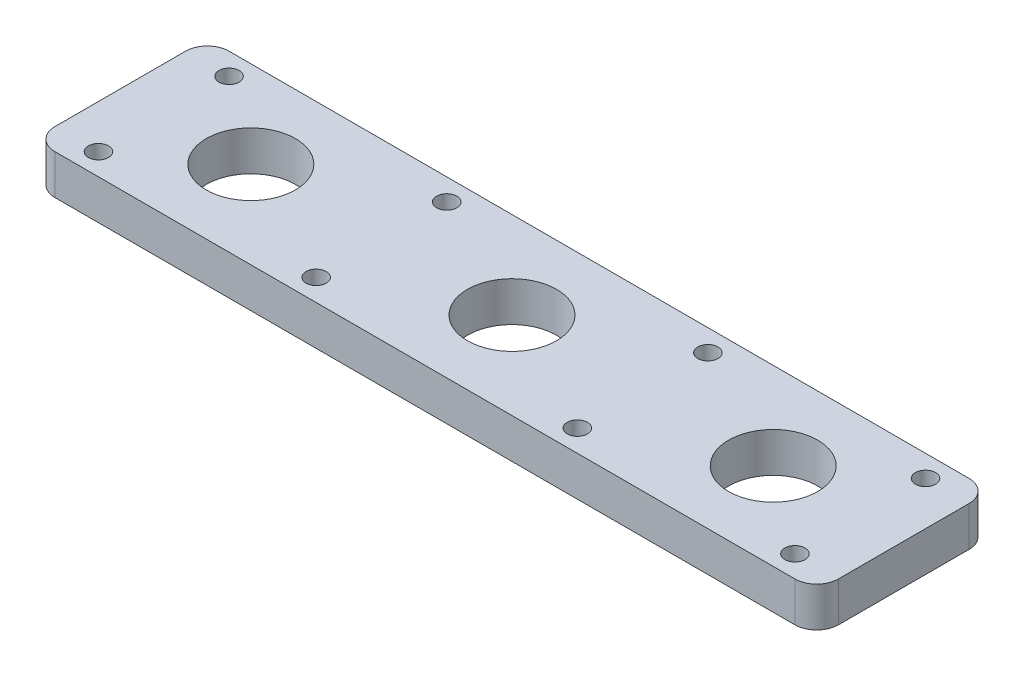
ISO-10303-21;
HEADER;
FILE_DESCRIPTION(('STEP AP214'),'2;1');
FILE_NAME('part.step','',(''),(''),'','','');
FILE_SCHEMA(('AUTOMOTIVE_DESIGN { 1 0 10303 214 1 1 1 1 }'));
ENDSEC;
DATA;
#1=APPLICATION_CONTEXT('core data for automotive mechanical design processes');
#2=APPLICATION_PROTOCOL_DEFINITION('international standard','automotive_design',2000,#1);
#3=PRODUCT_CONTEXT('',#1,'mechanical');
#4=PRODUCT('Part','Part','',(#3));
#5=PRODUCT_RELATED_PRODUCT_CATEGORY('part','',(#4));
#6=PRODUCT_DEFINITION_FORMATION('','',#4);
#7=PRODUCT_DEFINITION_CONTEXT('part definition',#1,'design');
#8=PRODUCT_DEFINITION('design','',#6,#7);
#9=PRODUCT_DEFINITION_SHAPE('','',#8);
#10=(LENGTH_UNIT() NAMED_UNIT(*) SI_UNIT(.MILLI.,.METRE.));
#11=(NAMED_UNIT(*) PLANE_ANGLE_UNIT() SI_UNIT($,.RADIAN.));
#12=(NAMED_UNIT(*) SI_UNIT($,.STERADIAN.) SOLID_ANGLE_UNIT());
#13=UNCERTAINTY_MEASURE_WITH_UNIT(LENGTH_MEASURE(1.E-05),#10,'distance_accuracy_value','');
#14=(GEOMETRIC_REPRESENTATION_CONTEXT(3) GLOBAL_UNCERTAINTY_ASSIGNED_CONTEXT((#13)) GLOBAL_UNIT_ASSIGNED_CONTEXT((#10,
#11,#12)) REPRESENTATION_CONTEXT('',''));
#15=CARTESIAN_POINT('',(0.,0.,0.));
#16=DIRECTION('',(0.,0.,1.));
#17=DIRECTION('',(1.,0.,0.));
#18=AXIS2_PLACEMENT_3D('',#15,#16,#17);
#19=CARTESIAN_POINT('',(0.,5.8,-25.4));
#20=DIRECTION('',(0.,1.,0.));
#21=DIRECTION('',(0.,0.,1.));
#22=AXIS2_PLACEMENT_3D('',#19,#20,#21);
#23=PLANE('',#22);
#24=CARTESIAN_POINT('',(-107.95,5.8,-22.225));
#25=DIRECTION('',(0.,1.,0.));
#26=DIRECTION('',(0.,0.,1.));
#27=AXIS2_PLACEMENT_3D('',#24,#25,#26);
#28=CIRCLE('',#27,1.47319999999999);
#29=CARTESIAN_POINT('',(-107.95,5.8,-20.7518));
#30=VERTEX_POINT('',#29);
#31=EDGE_CURVE('E236',#30,#30,#28,.T.);
#32=ORIENTED_EDGE('',*,*,#31,.F.);
#33=EDGE_LOOP('',(#32));
#34=FACE_BOUND('',#33,.T.);
#35=CARTESIAN_POINT('',(-107.95,5.8,-3.17499999999999));
#36=DIRECTION('',(0.,1.,0.));
#37=DIRECTION('',(0.,0.,1.));
#38=AXIS2_PLACEMENT_3D('',#35,#36,#37);
#39=CIRCLE('',#38,1.47319999999999);
#40=CARTESIAN_POINT('',(-107.95,5.8,-1.7018));
#41=VERTEX_POINT('',#40);
#42=EDGE_CURVE('E230',#41,#41,#39,.T.);
#43=ORIENTED_EDGE('',*,*,#42,.F.);
#44=EDGE_LOOP('',(#43));
#45=FACE_BOUND('',#44,.T.);
#46=CARTESIAN_POINT('',(-76.2,5.8,-22.225));
#47=DIRECTION('',(0.,1.,0.));
#48=DIRECTION('',(0.,0.,1.));
#49=AXIS2_PLACEMENT_3D('',#46,#47,#48);
#50=CIRCLE('',#49,1.47319999999999);
#51=CARTESIAN_POINT('',(-76.2,5.8,-20.7518));
#52=VERTEX_POINT('',#51);
#53=EDGE_CURVE('E224',#52,#52,#50,.T.);
#54=ORIENTED_EDGE('',*,*,#53,.F.);
#55=EDGE_LOOP('',(#54));
#56=FACE_BOUND('',#55,.T.);
#57=CARTESIAN_POINT('',(-76.2,5.8,-3.17499999999999));
#58=DIRECTION('',(0.,1.,0.));
#59=DIRECTION('',(0.,0.,1.));
#60=AXIS2_PLACEMENT_3D('',#57,#58,#59);
#61=CIRCLE('',#60,1.47319999999999);
#62=CARTESIAN_POINT('',(-76.2,5.8,-1.7018));
#63=VERTEX_POINT('',#62);
#64=EDGE_CURVE('E218',#63,#63,#61,.T.);
#65=ORIENTED_EDGE('',*,*,#64,.F.);
#66=EDGE_LOOP('',(#65));
#67=FACE_BOUND('',#66,.T.);
#68=CARTESIAN_POINT('',(-6.34999999999999,5.8,-22.225));
#69=DIRECTION('',(0.,1.,0.));
#70=DIRECTION('',(0.,0.,1.));
#71=AXIS2_PLACEMENT_3D('',#68,#69,#70);
#72=CIRCLE('',#71,1.4732);
#73=CARTESIAN_POINT('',(-6.34999999999999,5.8,-20.7518));
#74=VERTEX_POINT('',#73);
#75=EDGE_CURVE('E212',#74,#74,#72,.T.);
#76=ORIENTED_EDGE('',*,*,#75,.F.);
#77=EDGE_LOOP('',(#76));
#78=FACE_BOUND('',#77,.T.);
#79=CARTESIAN_POINT('',(-38.1,5.8,-22.225));
#80=DIRECTION('',(0.,1.,0.));
#81=DIRECTION('',(0.,0.,1.));
#82=AXIS2_PLACEMENT_3D('',#79,#80,#81);
#83=CIRCLE('',#82,1.4732);
#84=CARTESIAN_POINT('',(-38.1,5.8,-20.7518));
#85=VERTEX_POINT('',#84);
#86=EDGE_CURVE('E206',#85,#85,#83,.T.);
#87=ORIENTED_EDGE('',*,*,#86,.F.);
#88=EDGE_LOOP('',(#87));
#89=FACE_BOUND('',#88,.T.);
#90=CARTESIAN_POINT('',(-38.1,5.8,-3.17499999999999));
#91=DIRECTION('',(0.,1.,0.));
#92=DIRECTION('',(0.,0.,1.));
#93=AXIS2_PLACEMENT_3D('',#90,#91,#92);
#94=CIRCLE('',#93,1.4732);
#95=CARTESIAN_POINT('',(-38.1,5.8,-1.70179999999999));
#96=VERTEX_POINT('',#95);
#97=EDGE_CURVE('E200',#96,#96,#94,.T.);
#98=ORIENTED_EDGE('',*,*,#97,.F.);
#99=EDGE_LOOP('',(#98));
#100=FACE_BOUND('',#99,.T.);
#101=CARTESIAN_POINT('',(-6.34999999999999,5.8,-3.175));
#102=DIRECTION('',(0.,1.,0.));
#103=DIRECTION('',(0.,0.,1.));
#104=AXIS2_PLACEMENT_3D('',#101,#102,#103);
#105=CIRCLE('',#104,1.4732);
#106=CARTESIAN_POINT('',(-6.34999999999999,5.8,-1.7018));
#107=VERTEX_POINT('',#106);
#108=EDGE_CURVE('E194',#107,#107,#105,.T.);
#109=ORIENTED_EDGE('',*,*,#108,.F.);
#110=EDGE_LOOP('',(#109));
#111=FACE_BOUND('',#110,.T.);
#112=CARTESIAN_POINT('',(-57.15,5.8,-12.7));
#113=DIRECTION('',(0.,1.,0.));
#114=DIRECTION('',(0.,0.,1.));
#115=AXIS2_PLACEMENT_3D('',#112,#113,#114);
#116=CIRCLE('',#115,6.5);
#117=CARTESIAN_POINT('',(-57.15,5.8,-6.19999999999999));
#118=VERTEX_POINT('',#117);
#119=EDGE_CURVE('E178',#118,#118,#116,.T.);
#120=ORIENTED_EDGE('',*,*,#119,.F.);
#121=EDGE_LOOP('',(#120));
#122=FACE_BOUND('',#121,.T.);
#123=DIRECTION('',(1.,0.,0.));
#124=VECTOR('',#123,1.);
#125=CARTESIAN_POINT('',(0.,5.8,0.));
#126=LINE('',#125,#124);
#127=CARTESIAN_POINT('',(-111.125,5.8,0.));
#128=VERTEX_POINT('',#127);
#129=CARTESIAN_POINT('',(-3.175,5.8,0.));
#130=VERTEX_POINT('',#129);
#131=EDGE_CURVE('E134',#128,#130,#126,.T.);
#132=ORIENTED_EDGE('',*,*,#131,.T.);
#133=CARTESIAN_POINT('',(-3.175,5.8,-3.175));
#134=DIRECTION('',(0.,1.,0.));
#135=DIRECTION('',(0.,0.,1.));
#136=AXIS2_PLACEMENT_3D('',#133,#134,#135);
#137=CIRCLE('',#136,3.175);
#138=CARTESIAN_POINT('',(0.,5.8,-3.175));
#139=VERTEX_POINT('',#138);
#140=EDGE_CURVE('E153',#130,#139,#137,.T.);
#141=ORIENTED_EDGE('',*,*,#140,.T.);
#142=DIRECTION('',(0.,0.,-1.));
#143=VECTOR('',#142,1.);
#144=CARTESIAN_POINT('',(0.,5.8,0.));
#145=LINE('',#144,#143);
#146=CARTESIAN_POINT('',(0.,5.8,-22.225));
#147=VERTEX_POINT('',#146);
#148=EDGE_CURVE('E117',#139,#147,#145,.T.);
#149=ORIENTED_EDGE('',*,*,#148,.T.);
#150=CARTESIAN_POINT('',(-3.17500000000001,5.8,-22.225));
#151=DIRECTION('',(0.,1.,0.));
#152=DIRECTION('',(0.,0.,1.));
#153=AXIS2_PLACEMENT_3D('',#150,#151,#152);
#154=CIRCLE('',#153,3.175);
#155=CARTESIAN_POINT('',(-3.17500000000001,5.8,-25.4));
#156=VERTEX_POINT('',#155);
#157=EDGE_CURVE('E151',#147,#156,#154,.T.);
#158=ORIENTED_EDGE('',*,*,#157,.T.);
#159=DIRECTION('',(-1.,0.,0.));
#160=VECTOR('',#159,1.);
#161=CARTESIAN_POINT('',(0.,5.8,-25.4));
#162=LINE('',#161,#160);
#163=CARTESIAN_POINT('',(-111.125,5.8,-25.4));
#164=VERTEX_POINT('',#163);
#165=EDGE_CURVE('E173',#156,#164,#162,.T.);
#166=ORIENTED_EDGE('',*,*,#165,.T.);
#167=CARTESIAN_POINT('',(-111.125,5.8,-22.225));
#168=DIRECTION('',(0.,1.,0.));
#169=DIRECTION('',(0.,0.,1.));
#170=AXIS2_PLACEMENT_3D('',#167,#168,#169);
#171=CIRCLE('',#170,3.175);
#172=CARTESIAN_POINT('',(-114.3,5.8,-22.225));
#173=VERTEX_POINT('',#172);
#174=EDGE_CURVE('E52',#164,#173,#171,.T.);
#175=ORIENTED_EDGE('',*,*,#174,.T.);
#176=DIRECTION('',(0.,0.,1.));
#177=VECTOR('',#176,1.);
#178=CARTESIAN_POINT('',(-114.3,5.8,0.));
#179=LINE('',#178,#177);
#180=CARTESIAN_POINT('',(-114.3,5.8,-3.17499999999999));
#181=VERTEX_POINT('',#180);
#182=EDGE_CURVE('E163',#173,#181,#179,.T.);
#183=ORIENTED_EDGE('',*,*,#182,.T.);
#184=CARTESIAN_POINT('',(-111.125,5.8,-3.17499999999999));
#185=DIRECTION('',(0.,1.,0.));
#186=DIRECTION('',(0.,0.,1.));
#187=AXIS2_PLACEMENT_3D('',#184,#185,#186);
#188=CIRCLE('',#187,3.175);
#189=EDGE_CURVE('E149',#181,#128,#188,.T.);
#190=ORIENTED_EDGE('',*,*,#189,.T.);
#191=EDGE_LOOP('',(#132,#141,#149,#158,#166,#175,#183,#190));
#192=FACE_BOUND('',#191,.T.);
#193=CARTESIAN_POINT('',(-95.25,5.8,-12.7));
#194=DIRECTION('',(0.,1.,0.));
#195=DIRECTION('',(0.,0.,1.));
#196=AXIS2_PLACEMENT_3D('',#193,#194,#195);
#197=CIRCLE('',#196,6.5);
#198=CARTESIAN_POINT('',(-95.25,5.8,-6.19999999999999));
#199=VERTEX_POINT('',#198);
#200=EDGE_CURVE('E125',#199,#199,#197,.T.);
#201=ORIENTED_EDGE('',*,*,#200,.F.);
#202=EDGE_LOOP('',(#201));
#203=FACE_BOUND('',#202,.T.);
#204=CARTESIAN_POINT('',(-19.05,5.8,-12.7));
#205=DIRECTION('',(0.,1.,0.));
#206=DIRECTION('',(0.,0.,1.));
#207=AXIS2_PLACEMENT_3D('',#204,#205,#206);
#208=CIRCLE('',#207,6.5);
#209=CARTESIAN_POINT('',(-19.05,5.8,-6.19999999999999));
#210=VERTEX_POINT('',#209);
#211=EDGE_CURVE('E183',#210,#210,#208,.T.);
#212=ORIENTED_EDGE('',*,*,#211,.F.);
#213=EDGE_LOOP('',(#212));
#214=FACE_BOUND('',#213,.T.);
#215=ADVANCED_FACE('F32',(#34,#45,#56,#67,#78,#89,#100,#111,#122,#192,#203,#214),#23,.T.);
#216=CARTESIAN_POINT('',(0.,0.,-25.4));
#217=DIRECTION('',(0.,1.,0.));
#218=DIRECTION('',(0.,0.,1.));
#219=AXIS2_PLACEMENT_3D('',#216,#217,#218);
#220=PLANE('',#219);
#221=CARTESIAN_POINT('',(-107.95,0.,-22.225));
#222=DIRECTION('',(0.,1.,0.));
#223=DIRECTION('',(0.,0.,1.));
#224=AXIS2_PLACEMENT_3D('',#221,#222,#223);
#225=CIRCLE('',#224,1.47319999999999);
#226=CARTESIAN_POINT('',(-107.95,0.,-20.7518));
#227=VERTEX_POINT('',#226);
#228=EDGE_CURVE('E233',#227,#227,#225,.T.);
#229=ORIENTED_EDGE('',*,*,#228,.T.);
#230=EDGE_LOOP('',(#229));
#231=FACE_BOUND('',#230,.T.);
#232=CARTESIAN_POINT('',(-107.95,0.,-3.17499999999999));
#233=DIRECTION('',(0.,1.,0.));
#234=DIRECTION('',(0.,0.,1.));
#235=AXIS2_PLACEMENT_3D('',#232,#233,#234);
#236=CIRCLE('',#235,1.47319999999999);
#237=CARTESIAN_POINT('',(-107.95,0.,-1.7018));
#238=VERTEX_POINT('',#237);
#239=EDGE_CURVE('E227',#238,#238,#236,.T.);
#240=ORIENTED_EDGE('',*,*,#239,.T.);
#241=EDGE_LOOP('',(#240));
#242=FACE_BOUND('',#241,.T.);
#243=CARTESIAN_POINT('',(-76.2,0.,-22.225));
#244=DIRECTION('',(0.,1.,0.));
#245=DIRECTION('',(0.,0.,1.));
#246=AXIS2_PLACEMENT_3D('',#243,#244,#245);
#247=CIRCLE('',#246,1.47319999999999);
#248=CARTESIAN_POINT('',(-76.2,0.,-20.7518));
#249=VERTEX_POINT('',#248);
#250=EDGE_CURVE('E221',#249,#249,#247,.T.);
#251=ORIENTED_EDGE('',*,*,#250,.T.);
#252=EDGE_LOOP('',(#251));
#253=FACE_BOUND('',#252,.T.);
#254=CARTESIAN_POINT('',(-76.2,0.,-3.17499999999999));
#255=DIRECTION('',(0.,1.,0.));
#256=DIRECTION('',(0.,0.,1.));
#257=AXIS2_PLACEMENT_3D('',#254,#255,#256);
#258=CIRCLE('',#257,1.47319999999999);
#259=CARTESIAN_POINT('',(-76.2,0.,-1.7018));
#260=VERTEX_POINT('',#259);
#261=EDGE_CURVE('E215',#260,#260,#258,.T.);
#262=ORIENTED_EDGE('',*,*,#261,.T.);
#263=EDGE_LOOP('',(#262));
#264=FACE_BOUND('',#263,.T.);
#265=CARTESIAN_POINT('',(-6.34999999999999,0.,-22.225));
#266=DIRECTION('',(0.,1.,0.));
#267=DIRECTION('',(0.,0.,1.));
#268=AXIS2_PLACEMENT_3D('',#265,#266,#267);
#269=CIRCLE('',#268,1.4732);
#270=CARTESIAN_POINT('',(-6.34999999999999,0.,-20.7518));
#271=VERTEX_POINT('',#270);
#272=EDGE_CURVE('E209',#271,#271,#269,.T.);
#273=ORIENTED_EDGE('',*,*,#272,.T.);
#274=EDGE_LOOP('',(#273));
#275=FACE_BOUND('',#274,.T.);
#276=CARTESIAN_POINT('',(-38.1,0.,-22.225));
#277=DIRECTION('',(0.,1.,0.));
#278=DIRECTION('',(0.,0.,1.));
#279=AXIS2_PLACEMENT_3D('',#276,#277,#278);
#280=CIRCLE('',#279,1.4732);
#281=CARTESIAN_POINT('',(-38.1,0.,-20.7518));
#282=VERTEX_POINT('',#281);
#283=EDGE_CURVE('E203',#282,#282,#280,.T.);
#284=ORIENTED_EDGE('',*,*,#283,.T.);
#285=EDGE_LOOP('',(#284));
#286=FACE_BOUND('',#285,.T.);
#287=CARTESIAN_POINT('',(-38.1,0.,-3.17499999999999));
#288=DIRECTION('',(0.,1.,0.));
#289=DIRECTION('',(0.,0.,1.));
#290=AXIS2_PLACEMENT_3D('',#287,#288,#289);
#291=CIRCLE('',#290,1.4732);
#292=CARTESIAN_POINT('',(-38.1,0.,-1.70179999999999));
#293=VERTEX_POINT('',#292);
#294=EDGE_CURVE('E197',#293,#293,#291,.T.);
#295=ORIENTED_EDGE('',*,*,#294,.T.);
#296=EDGE_LOOP('',(#295));
#297=FACE_BOUND('',#296,.T.);
#298=CARTESIAN_POINT('',(-6.34999999999999,0.,-3.175));
#299=DIRECTION('',(0.,1.,0.));
#300=DIRECTION('',(0.,0.,1.));
#301=AXIS2_PLACEMENT_3D('',#298,#299,#300);
#302=CIRCLE('',#301,1.4732);
#303=CARTESIAN_POINT('',(-6.34999999999999,0.,-1.7018));
#304=VERTEX_POINT('',#303);
#305=EDGE_CURVE('E189',#304,#304,#302,.T.);
#306=ORIENTED_EDGE('',*,*,#305,.T.);
#307=EDGE_LOOP('',(#306));
#308=FACE_BOUND('',#307,.T.);
#309=CARTESIAN_POINT('',(-57.15,0.,-12.7));
#310=DIRECTION('',(0.,1.,0.));
#311=DIRECTION('',(0.,0.,1.));
#312=AXIS2_PLACEMENT_3D('',#309,#310,#311);
#313=CIRCLE('',#312,6.5);
#314=CARTESIAN_POINT('',(-57.15,0.,-6.19999999999999));
#315=VERTEX_POINT('',#314);
#316=EDGE_CURVE('E180',#315,#315,#313,.T.);
#317=ORIENTED_EDGE('',*,*,#316,.T.);
#318=EDGE_LOOP('',(#317));
#319=FACE_BOUND('',#318,.T.);
#320=DIRECTION('',(0.,0.,-1.));
#321=VECTOR('',#320,1.);
#322=CARTESIAN_POINT('',(0.,0.,0.));
#323=LINE('',#322,#321);
#324=CARTESIAN_POINT('',(0.,0.,-3.175));
#325=VERTEX_POINT('',#324);
#326=CARTESIAN_POINT('',(0.,0.,-22.225));
#327=VERTEX_POINT('',#326);
#328=EDGE_CURVE('E114',#325,#327,#323,.T.);
#329=ORIENTED_EDGE('',*,*,#328,.F.);
#330=CARTESIAN_POINT('',(-3.175,0.,-3.175));
#331=DIRECTION('',(0.,1.,0.));
#332=DIRECTION('',(0.,0.,1.));
#333=AXIS2_PLACEMENT_3D('',#330,#331,#332);
#334=CIRCLE('',#333,3.175);
#335=CARTESIAN_POINT('',(-3.175,0.,0.));
#336=VERTEX_POINT('',#335);
#337=EDGE_CURVE('E97',#325,#336,#334,.F.);
#338=ORIENTED_EDGE('',*,*,#337,.T.);
#339=DIRECTION('',(1.,0.,0.));
#340=VECTOR('',#339,1.);
#341=CARTESIAN_POINT('',(0.,0.,0.));
#342=LINE('',#341,#340);
#343=CARTESIAN_POINT('',(-111.125,0.,0.));
#344=VERTEX_POINT('',#343);
#345=EDGE_CURVE('E138',#344,#336,#342,.T.);
#346=ORIENTED_EDGE('',*,*,#345,.F.);
#347=CARTESIAN_POINT('',(-111.125,0.,-3.17499999999999));
#348=DIRECTION('',(0.,1.,0.));
#349=DIRECTION('',(0.,0.,1.));
#350=AXIS2_PLACEMENT_3D('',#347,#348,#349);
#351=CIRCLE('',#350,3.175);
#352=CARTESIAN_POINT('',(-114.3,0.,-3.17499999999999));
#353=VERTEX_POINT('',#352);
#354=EDGE_CURVE('E142',#344,#353,#351,.F.);
#355=ORIENTED_EDGE('',*,*,#354,.T.);
#356=DIRECTION('',(0.,0.,1.));
#357=VECTOR('',#356,1.);
#358=CARTESIAN_POINT('',(-114.3,0.,0.));
#359=LINE('',#358,#357);
#360=CARTESIAN_POINT('',(-114.3,0.,-22.225));
#361=VERTEX_POINT('',#360);
#362=EDGE_CURVE('E128',#361,#353,#359,.T.);
#363=ORIENTED_EDGE('',*,*,#362,.F.);
#364=CARTESIAN_POINT('',(-111.125,0.,-22.225));
#365=DIRECTION('',(0.,1.,0.));
#366=DIRECTION('',(0.,0.,1.));
#367=AXIS2_PLACEMENT_3D('',#364,#365,#366);
#368=CIRCLE('',#367,3.175);
#369=CARTESIAN_POINT('',(-111.125,0.,-25.4));
#370=VERTEX_POINT('',#369);
#371=EDGE_CURVE('E118',#361,#370,#368,.F.);
#372=ORIENTED_EDGE('',*,*,#371,.T.);
#373=DIRECTION('',(-1.,0.,0.));
#374=VECTOR('',#373,1.);
#375=CARTESIAN_POINT('',(0.,0.,-25.4));
#376=LINE('',#375,#374);
#377=CARTESIAN_POINT('',(-3.17500000000001,0.,-25.4));
#378=VERTEX_POINT('',#377);
#379=EDGE_CURVE('E124',#378,#370,#376,.T.);
#380=ORIENTED_EDGE('',*,*,#379,.F.);
#381=CARTESIAN_POINT('',(-3.17500000000001,0.,-22.225));
#382=DIRECTION('',(0.,1.,0.));
#383=DIRECTION('',(0.,0.,1.));
#384=AXIS2_PLACEMENT_3D('',#381,#382,#383);
#385=CIRCLE('',#384,3.175);
#386=EDGE_CURVE('E108',#378,#327,#385,.F.);
#387=ORIENTED_EDGE('',*,*,#386,.T.);
#388=EDGE_LOOP('',(#329,#338,#346,#355,#363,#372,#380,#387));
#389=FACE_BOUND('',#388,.T.);
#390=CARTESIAN_POINT('',(-95.25,0.,-12.7));
#391=DIRECTION('',(0.,1.,0.));
#392=DIRECTION('',(0.,0.,1.));
#393=AXIS2_PLACEMENT_3D('',#390,#391,#392);
#394=CIRCLE('',#393,6.5);
#395=CARTESIAN_POINT('',(-95.25,0.,-6.19999999999999));
#396=VERTEX_POINT('',#395);
#397=EDGE_CURVE('E131',#396,#396,#394,.T.);
#398=ORIENTED_EDGE('',*,*,#397,.T.);
#399=EDGE_LOOP('',(#398));
#400=FACE_BOUND('',#399,.T.);
#401=CARTESIAN_POINT('',(-19.05,0.,-12.7));
#402=DIRECTION('',(0.,1.,0.));
#403=DIRECTION('',(0.,0.,1.));
#404=AXIS2_PLACEMENT_3D('',#401,#402,#403);
#405=CIRCLE('',#404,6.5);
#406=CARTESIAN_POINT('',(-19.05,0.,-6.19999999999999));
#407=VERTEX_POINT('',#406);
#408=EDGE_CURVE('E186',#407,#407,#405,.T.);
#409=ORIENTED_EDGE('',*,*,#408,.T.);
#410=EDGE_LOOP('',(#409));
#411=FACE_BOUND('',#410,.T.);
#412=ADVANCED_FACE('F121',(#231,#242,#253,#264,#275,#286,#297,#308,#319,#389,#400,#411),#220,.F.);
#413=CARTESIAN_POINT('',(0.,5.8,0.));
#414=DIRECTION('',(-1.,0.,0.));
#415=DIRECTION('',(0.,0.,1.));
#416=AXIS2_PLACEMENT_3D('',#413,#414,#415);
#417=PLANE('',#416);
#418=ORIENTED_EDGE('',*,*,#148,.F.);
#419=DIRECTION('',(0.,-1.,0.));
#420=VECTOR('',#419,1.);
#421=CARTESIAN_POINT('',(0.,5.8,-3.175));
#422=LINE('',#421,#420);
#423=EDGE_CURVE('E101',#139,#325,#422,.T.);
#424=ORIENTED_EDGE('',*,*,#423,.T.);
#425=ORIENTED_EDGE('',*,*,#328,.T.);
#426=DIRECTION('',(0.,-1.,0.));
#427=VECTOR('',#426,1.);
#428=CARTESIAN_POINT('',(0.,5.8,-22.225));
#429=LINE('',#428,#427);
#430=EDGE_CURVE('E119',#327,#147,#429,.F.);
#431=ORIENTED_EDGE('',*,*,#430,.T.);
#432=EDGE_LOOP('',(#418,#424,#425,#431));
#433=FACE_BOUND('',#432,.T.);
#434=ADVANCED_FACE('F113',(#433),#417,.F.);
#435=CARTESIAN_POINT('',(0.,5.8,-25.4));
#436=DIRECTION('',(0.,0.,1.));
#437=DIRECTION('',(1.,0.,0.));
#438=AXIS2_PLACEMENT_3D('',#435,#436,#437);
#439=PLANE('',#438);
#440=ORIENTED_EDGE('',*,*,#165,.F.);
#441=DIRECTION('',(0.,-1.,0.));
#442=VECTOR('',#441,1.);
#443=CARTESIAN_POINT('',(-3.17500000000001,5.8,-25.4));
#444=LINE('',#443,#442);
#445=EDGE_CURVE('E157',#156,#378,#444,.T.);
#446=ORIENTED_EDGE('',*,*,#445,.T.);
#447=ORIENTED_EDGE('',*,*,#379,.T.);
#448=DIRECTION('',(0.,-1.,0.));
#449=VECTOR('',#448,1.);
#450=CARTESIAN_POINT('',(-111.125,5.8,-25.4));
#451=LINE('',#450,#449);
#452=EDGE_CURVE('E155',#370,#164,#451,.F.);
#453=ORIENTED_EDGE('',*,*,#452,.T.);
#454=EDGE_LOOP('',(#440,#446,#447,#453));
#455=FACE_BOUND('',#454,.T.);
#456=ADVANCED_FACE('F279',(#455),#439,.F.);
#457=CARTESIAN_POINT('',(-114.3,5.8,0.));
#458=DIRECTION('',(1.,0.,0.));
#459=DIRECTION('',(0.,0.,-1.));
#460=AXIS2_PLACEMENT_3D('',#457,#458,#459);
#461=PLANE('',#460);
#462=ORIENTED_EDGE('',*,*,#362,.T.);
#463=DIRECTION('',(0.,-1.,0.));
#464=VECTOR('',#463,1.);
#465=CARTESIAN_POINT('',(-114.3,5.8,-3.17499999999999));
#466=LINE('',#465,#464);
#467=EDGE_CURVE('E11',#353,#181,#466,.F.);
#468=ORIENTED_EDGE('',*,*,#467,.T.);
#469=ORIENTED_EDGE('',*,*,#182,.F.);
#470=DIRECTION('',(0.,-1.,0.));
#471=VECTOR('',#470,1.);
#472=CARTESIAN_POINT('',(-114.3,5.8,-22.225));
#473=LINE('',#472,#471);
#474=EDGE_CURVE('E40',#173,#361,#473,.T.);
#475=ORIENTED_EDGE('',*,*,#474,.T.);
#476=EDGE_LOOP('',(#462,#468,#469,#475));
#477=FACE_BOUND('',#476,.T.);
#478=ADVANCED_FACE('F162',(#477),#461,.F.);
#479=CARTESIAN_POINT('',(0.,5.8,0.));
#480=DIRECTION('',(0.,0.,-1.));
#481=DIRECTION('',(-1.,0.,0.));
#482=AXIS2_PLACEMENT_3D('',#479,#480,#481);
#483=PLANE('',#482);
#484=ORIENTED_EDGE('',*,*,#345,.T.);
#485=DIRECTION('',(0.,-1.,0.));
#486=VECTOR('',#485,1.);
#487=CARTESIAN_POINT('',(-3.175,5.8,0.));
#488=LINE('',#487,#486);
#489=EDGE_CURVE('E102',#336,#130,#488,.F.);
#490=ORIENTED_EDGE('',*,*,#489,.T.);
#491=ORIENTED_EDGE('',*,*,#131,.F.);
#492=DIRECTION('',(0.,-1.,0.));
#493=VECTOR('',#492,1.);
#494=CARTESIAN_POINT('',(-111.125,5.8,0.));
#495=LINE('',#494,#493);
#496=EDGE_CURVE('E107',#128,#344,#495,.T.);
#497=ORIENTED_EDGE('',*,*,#496,.T.);
#498=EDGE_LOOP('',(#484,#490,#491,#497));
#499=FACE_BOUND('',#498,.T.);
#500=ADVANCED_FACE('F171',(#499),#483,.F.);
#501=CARTESIAN_POINT('',(-95.25,5.8,-12.7));
#502=DIRECTION('',(0.,-1.,0.));
#503=DIRECTION('',(0.,0.,-1.));
#504=AXIS2_PLACEMENT_3D('',#501,#502,#503);
#505=CYLINDRICAL_SURFACE('',#504,6.5);
#506=ORIENTED_EDGE('',*,*,#200,.T.);
#507=EDGE_LOOP('',(#506));
#508=FACE_BOUND('',#507,.T.);
#509=ORIENTED_EDGE('',*,*,#397,.F.);
#510=EDGE_LOOP('',(#509));
#511=FACE_BOUND('',#510,.T.);
#512=ADVANCED_FACE('F286',(#508,#511),#505,.F.);
#513=CARTESIAN_POINT('',(-57.15,5.8,-12.7));
#514=DIRECTION('',(0.,-1.,0.));
#515=DIRECTION('',(0.,0.,-1.));
#516=AXIS2_PLACEMENT_3D('',#513,#514,#515);
#517=CYLINDRICAL_SURFACE('',#516,6.5);
#518=ORIENTED_EDGE('',*,*,#119,.T.);
#519=EDGE_LOOP('',(#518));
#520=FACE_BOUND('',#519,.T.);
#521=ORIENTED_EDGE('',*,*,#316,.F.);
#522=EDGE_LOOP('',(#521));
#523=FACE_BOUND('',#522,.T.);
#524=ADVANCED_FACE('F269',(#520,#523),#517,.F.);
#525=CARTESIAN_POINT('',(-19.05,5.8,-12.7));
#526=DIRECTION('',(0.,-1.,0.));
#527=DIRECTION('',(0.,0.,-1.));
#528=AXIS2_PLACEMENT_3D('',#525,#526,#527);
#529=CYLINDRICAL_SURFACE('',#528,6.5);
#530=ORIENTED_EDGE('',*,*,#211,.T.);
#531=EDGE_LOOP('',(#530));
#532=FACE_BOUND('',#531,.T.);
#533=ORIENTED_EDGE('',*,*,#408,.F.);
#534=EDGE_LOOP('',(#533));
#535=FACE_BOUND('',#534,.T.);
#536=ADVANCED_FACE('F265',(#532,#535),#529,.F.);
#537=CARTESIAN_POINT('',(-6.34999999999999,5.8,-3.175));
#538=DIRECTION('',(0.,1.,0.));
#539=DIRECTION('',(0.,0.,1.));
#540=AXIS2_PLACEMENT_3D('',#537,#538,#539);
#541=CYLINDRICAL_SURFACE('',#540,1.4732);
#542=ORIENTED_EDGE('',*,*,#305,.F.);
#543=EDGE_LOOP('',(#542));
#544=FACE_BOUND('',#543,.T.);
#545=ORIENTED_EDGE('',*,*,#108,.T.);
#546=EDGE_LOOP('',(#545));
#547=FACE_BOUND('',#546,.T.);
#548=ADVANCED_FACE('F268',(#544,#547),#541,.F.);
#549=CARTESIAN_POINT('',(-38.1,5.8,-3.17499999999999));
#550=DIRECTION('',(0.,1.,0.));
#551=DIRECTION('',(0.,0.,1.));
#552=AXIS2_PLACEMENT_3D('',#549,#550,#551);
#553=CYLINDRICAL_SURFACE('',#552,1.4732);
#554=ORIENTED_EDGE('',*,*,#294,.F.);
#555=EDGE_LOOP('',(#554));
#556=FACE_BOUND('',#555,.T.);
#557=ORIENTED_EDGE('',*,*,#97,.T.);
#558=EDGE_LOOP('',(#557));
#559=FACE_BOUND('',#558,.T.);
#560=ADVANCED_FACE('F418',(#556,#559),#553,.F.);
#561=CARTESIAN_POINT('',(-38.1,5.8,-22.225));
#562=DIRECTION('',(0.,1.,0.));
#563=DIRECTION('',(0.,0.,1.));
#564=AXIS2_PLACEMENT_3D('',#561,#562,#563);
#565=CYLINDRICAL_SURFACE('',#564,1.4732);
#566=ORIENTED_EDGE('',*,*,#283,.F.);
#567=EDGE_LOOP('',(#566));
#568=FACE_BOUND('',#567,.T.);
#569=ORIENTED_EDGE('',*,*,#86,.T.);
#570=EDGE_LOOP('',(#569));
#571=FACE_BOUND('',#570,.T.);
#572=ADVANCED_FACE('F408',(#568,#571),#565,.F.);
#573=CARTESIAN_POINT('',(-6.34999999999999,5.8,-22.225));
#574=DIRECTION('',(0.,1.,0.));
#575=DIRECTION('',(0.,0.,1.));
#576=AXIS2_PLACEMENT_3D('',#573,#574,#575);
#577=CYLINDRICAL_SURFACE('',#576,1.4732);
#578=ORIENTED_EDGE('',*,*,#272,.F.);
#579=EDGE_LOOP('',(#578));
#580=FACE_BOUND('',#579,.T.);
#581=ORIENTED_EDGE('',*,*,#75,.T.);
#582=EDGE_LOOP('',(#581));
#583=FACE_BOUND('',#582,.T.);
#584=ADVANCED_FACE('F398',(#580,#583),#577,.F.);
#585=CARTESIAN_POINT('',(-76.2,5.8,-3.17499999999999));
#586=DIRECTION('',(0.,1.,0.));
#587=DIRECTION('',(0.,0.,1.));
#588=AXIS2_PLACEMENT_3D('',#585,#586,#587);
#589=CYLINDRICAL_SURFACE('',#588,1.47319999999999);
#590=ORIENTED_EDGE('',*,*,#261,.F.);
#591=EDGE_LOOP('',(#590));
#592=FACE_BOUND('',#591,.T.);
#593=ORIENTED_EDGE('',*,*,#64,.T.);
#594=EDGE_LOOP('',(#593));
#595=FACE_BOUND('',#594,.T.);
#596=ADVANCED_FACE('F388',(#592,#595),#589,.F.);
#597=CARTESIAN_POINT('',(-76.2,5.8,-22.225));
#598=DIRECTION('',(0.,1.,0.));
#599=DIRECTION('',(0.,0.,1.));
#600=AXIS2_PLACEMENT_3D('',#597,#598,#599);
#601=CYLINDRICAL_SURFACE('',#600,1.47319999999999);
#602=ORIENTED_EDGE('',*,*,#250,.F.);
#603=EDGE_LOOP('',(#602));
#604=FACE_BOUND('',#603,.T.);
#605=ORIENTED_EDGE('',*,*,#53,.T.);
#606=EDGE_LOOP('',(#605));
#607=FACE_BOUND('',#606,.T.);
#608=ADVANCED_FACE('F378',(#604,#607),#601,.F.);
#609=CARTESIAN_POINT('',(-107.95,5.8,-3.17499999999999));
#610=DIRECTION('',(0.,1.,0.));
#611=DIRECTION('',(0.,0.,1.));
#612=AXIS2_PLACEMENT_3D('',#609,#610,#611);
#613=CYLINDRICAL_SURFACE('',#612,1.47319999999999);
#614=ORIENTED_EDGE('',*,*,#239,.F.);
#615=EDGE_LOOP('',(#614));
#616=FACE_BOUND('',#615,.T.);
#617=ORIENTED_EDGE('',*,*,#42,.T.);
#618=EDGE_LOOP('',(#617));
#619=FACE_BOUND('',#618,.T.);
#620=ADVANCED_FACE('F368',(#616,#619),#613,.F.);
#621=CARTESIAN_POINT('',(-107.95,5.8,-22.225));
#622=DIRECTION('',(0.,1.,0.));
#623=DIRECTION('',(0.,0.,1.));
#624=AXIS2_PLACEMENT_3D('',#621,#622,#623);
#625=CYLINDRICAL_SURFACE('',#624,1.47319999999999);
#626=ORIENTED_EDGE('',*,*,#228,.F.);
#627=EDGE_LOOP('',(#626));
#628=FACE_BOUND('',#627,.T.);
#629=ORIENTED_EDGE('',*,*,#31,.T.);
#630=EDGE_LOOP('',(#629));
#631=FACE_BOUND('',#630,.T.);
#632=ADVANCED_FACE('F240',(#628,#631),#625,.F.);
#633=CARTESIAN_POINT('',(-3.175,5.8,-3.175));
#634=DIRECTION('',(0.,-1.,0.));
#635=DIRECTION('',(0.,0.,-1.));
#636=AXIS2_PLACEMENT_3D('',#633,#634,#635);
#637=CYLINDRICAL_SURFACE('',#636,3.175);
#638=ORIENTED_EDGE('',*,*,#140,.F.);
#639=ORIENTED_EDGE('',*,*,#489,.F.);
#640=ORIENTED_EDGE('',*,*,#337,.F.);
#641=ORIENTED_EDGE('',*,*,#423,.F.);
#642=EDGE_LOOP('',(#638,#639,#640,#641));
#643=FACE_BOUND('',#642,.T.);
#644=ADVANCED_FACE('F100',(#643),#637,.T.);
#645=CARTESIAN_POINT('',(-3.17500000000001,5.8,-22.225));
#646=DIRECTION('',(0.,-1.,0.));
#647=DIRECTION('',(0.,0.,-1.));
#648=AXIS2_PLACEMENT_3D('',#645,#646,#647);
#649=CYLINDRICAL_SURFACE('',#648,3.175);
#650=ORIENTED_EDGE('',*,*,#157,.F.);
#651=ORIENTED_EDGE('',*,*,#430,.F.);
#652=ORIENTED_EDGE('',*,*,#386,.F.);
#653=ORIENTED_EDGE('',*,*,#445,.F.);
#654=EDGE_LOOP('',(#650,#651,#652,#653));
#655=FACE_BOUND('',#654,.T.);
#656=ADVANCED_FACE('F294',(#655),#649,.T.);
#657=CARTESIAN_POINT('',(-111.125,5.8,-3.17499999999999));
#658=DIRECTION('',(0.,-1.,0.));
#659=DIRECTION('',(0.,0.,-1.));
#660=AXIS2_PLACEMENT_3D('',#657,#658,#659);
#661=CYLINDRICAL_SURFACE('',#660,3.175);
#662=ORIENTED_EDGE('',*,*,#189,.F.);
#663=ORIENTED_EDGE('',*,*,#467,.F.);
#664=ORIENTED_EDGE('',*,*,#354,.F.);
#665=ORIENTED_EDGE('',*,*,#496,.F.);
#666=EDGE_LOOP('',(#662,#663,#664,#665));
#667=FACE_BOUND('',#666,.T.);
#668=ADVANCED_FACE('F168',(#667),#661,.T.);
#669=CARTESIAN_POINT('',(-111.125,5.8,-22.225));
#670=DIRECTION('',(0.,-1.,0.));
#671=DIRECTION('',(0.,0.,-1.));
#672=AXIS2_PLACEMENT_3D('',#669,#670,#671);
#673=CYLINDRICAL_SURFACE('',#672,3.175);
#674=ORIENTED_EDGE('',*,*,#174,.F.);
#675=ORIENTED_EDGE('',*,*,#452,.F.);
#676=ORIENTED_EDGE('',*,*,#371,.F.);
#677=ORIENTED_EDGE('',*,*,#474,.F.);
#678=EDGE_LOOP('',(#674,#675,#676,#677));
#679=FACE_BOUND('',#678,.T.);
#680=ADVANCED_FACE('F34',(#679),#673,.T.);
#681=CLOSED_SHELL('',(#215,#412,#434,#456,#478,#500,#512,#524,#536,#548,#560,#572,#584,#596,
#608,#620,#632,#644,#656,#668,#680));
#682=MANIFOLD_SOLID_BREP('B2',#681);
#683=ADVANCED_BREP_SHAPE_REPRESENTATION('',(#18,#682),#14);
#684=SHAPE_DEFINITION_REPRESENTATION(#9,#683);
ENDSEC;
END-ISO-10303-21;
